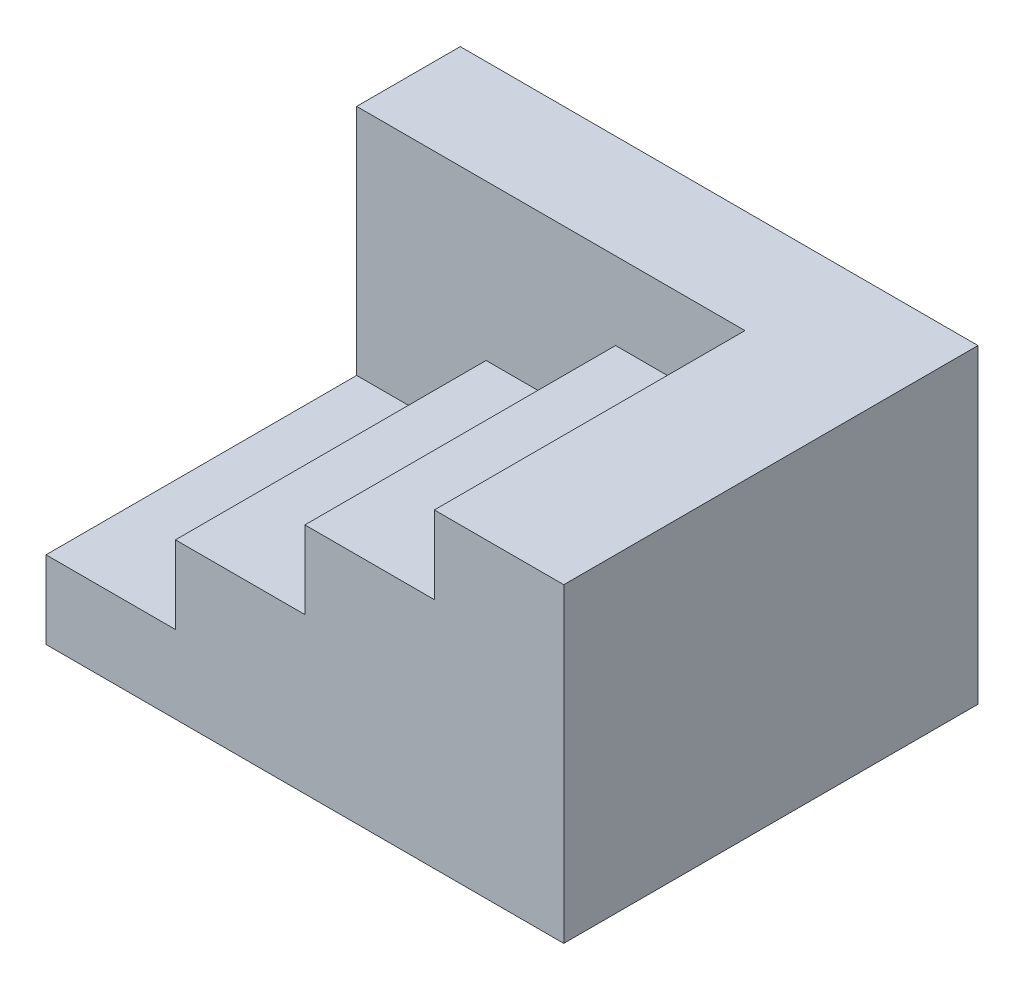
ISO-10303-21;
HEADER;
FILE_DESCRIPTION(('STEP AP214'),'2;1');
FILE_NAME('part.step','',(''),(''),'','','');
FILE_SCHEMA(('AUTOMOTIVE_DESIGN { 1 0 10303 214 1 1 1 1 }'));
ENDSEC;
DATA;
#1=APPLICATION_CONTEXT('core data for automotive mechanical design processes');
#2=APPLICATION_PROTOCOL_DEFINITION('international standard','automotive_design',2000,#1);
#3=PRODUCT_CONTEXT('',#1,'mechanical');
#4=PRODUCT('Part','Part','',(#3));
#5=PRODUCT_RELATED_PRODUCT_CATEGORY('part','',(#4));
#6=PRODUCT_DEFINITION_FORMATION('','',#4);
#7=PRODUCT_DEFINITION_CONTEXT('part definition',#1,'design');
#8=PRODUCT_DEFINITION('design','',#6,#7);
#9=PRODUCT_DEFINITION_SHAPE('','',#8);
#10=(LENGTH_UNIT() NAMED_UNIT(*) SI_UNIT(.MILLI.,.METRE.));
#11=(NAMED_UNIT(*) PLANE_ANGLE_UNIT() SI_UNIT($,.RADIAN.));
#12=(NAMED_UNIT(*) SI_UNIT($,.STERADIAN.) SOLID_ANGLE_UNIT());
#13=UNCERTAINTY_MEASURE_WITH_UNIT(LENGTH_MEASURE(1.E-05),#10,'distance_accuracy_value','');
#14=(GEOMETRIC_REPRESENTATION_CONTEXT(3) GLOBAL_UNCERTAINTY_ASSIGNED_CONTEXT((#13)) GLOBAL_UNIT_ASSIGNED_CONTEXT((#10,
#11,#12)) REPRESENTATION_CONTEXT('',''));
#15=CARTESIAN_POINT('',(0.,0.,0.));
#16=DIRECTION('',(0.,0.,1.));
#17=DIRECTION('',(1.,0.,0.));
#18=AXIS2_PLACEMENT_3D('',#15,#16,#17);
#19=CARTESIAN_POINT('',(0.,60.,0.));
#20=DIRECTION('',(1.,0.,0.));
#21=DIRECTION('',(0.,0.,-1.));
#22=AXIS2_PLACEMENT_3D('',#19,#20,#21);
#23=PLANE('',#22);
#24=DIRECTION('',(0.,-1.,0.));
#25=VECTOR('',#24,1.);
#26=CARTESIAN_POINT('',(0.,60.,0.));
#27=LINE('',#26,#25);
#28=CARTESIAN_POINT('',(0.,15.,0.));
#29=VERTEX_POINT('',#28);
#30=CARTESIAN_POINT('',(0.,0.,0.));
#31=VERTEX_POINT('',#30);
#32=EDGE_CURVE('E11',#29,#31,#27,.T.);
#33=ORIENTED_EDGE('',*,*,#32,.F.);
#34=DIRECTION('',(0.,0.,1.));
#35=VECTOR('',#34,1.);
#36=CARTESIAN_POINT('',(0.,15.,-60.));
#37=LINE('',#36,#35);
#38=CARTESIAN_POINT('',(0.,15.,-60.));
#39=VERTEX_POINT('',#38);
#40=EDGE_CURVE('E142',#39,#29,#37,.T.);
#41=ORIENTED_EDGE('',*,*,#40,.F.);
#42=DIRECTION('',(0.,-1.,0.));
#43=VECTOR('',#42,1.);
#44=CARTESIAN_POINT('',(0.,15.,-60.));
#45=LINE('',#44,#43);
#46=CARTESIAN_POINT('',(0.,60.,-60.));
#47=VERTEX_POINT('',#46);
#48=EDGE_CURVE('E149',#47,#39,#45,.T.);
#49=ORIENTED_EDGE('',*,*,#48,.F.);
#50=DIRECTION('',(0.,0.,1.));
#51=VECTOR('',#50,1.);
#52=CARTESIAN_POINT('',(0.,60.,0.));
#53=LINE('',#52,#51);
#54=CARTESIAN_POINT('',(0.,60.,-80.));
#55=VERTEX_POINT('',#54);
#56=EDGE_CURVE('E171',#55,#47,#53,.T.);
#57=ORIENTED_EDGE('',*,*,#56,.F.);
#58=DIRECTION('',(0.,-1.,0.));
#59=VECTOR('',#58,1.);
#60=CARTESIAN_POINT('',(0.,60.,-80.));
#61=LINE('',#60,#59);
#62=CARTESIAN_POINT('',(0.,0.,-80.));
#63=VERTEX_POINT('',#62);
#64=EDGE_CURVE('E181',#55,#63,#61,.T.);
#65=ORIENTED_EDGE('',*,*,#64,.T.);
#66=DIRECTION('',(0.,0.,1.));
#67=VECTOR('',#66,1.);
#68=CARTESIAN_POINT('',(0.,0.,0.));
#69=LINE('',#68,#67);
#70=EDGE_CURVE('E182',#63,#31,#69,.T.);
#71=ORIENTED_EDGE('',*,*,#70,.T.);
#72=EDGE_LOOP('',(#33,#41,#49,#57,#65,#71));
#73=FACE_BOUND('',#72,.T.);
#74=ADVANCED_FACE('F45',(#73),#23,.F.);
#75=CARTESIAN_POINT('',(0.,60.,0.));
#76=DIRECTION('',(0.,0.,-1.));
#77=DIRECTION('',(-1.,0.,0.));
#78=AXIS2_PLACEMENT_3D('',#75,#76,#77);
#79=PLANE('',#78);
#80=DIRECTION('',(1.,0.,0.));
#81=VECTOR('',#80,1.);
#82=CARTESIAN_POINT('',(0.,60.,0.));
#83=LINE('',#82,#81);
#84=CARTESIAN_POINT('',(75.,60.,0.));
#85=VERTEX_POINT('',#84);
#86=CARTESIAN_POINT('',(100.,60.,0.));
#87=VERTEX_POINT('',#86);
#88=EDGE_CURVE('E93',#85,#87,#83,.T.);
#89=ORIENTED_EDGE('',*,*,#88,.F.);
#90=DIRECTION('',(0.,1.,0.));
#91=VECTOR('',#90,1.);
#92=CARTESIAN_POINT('',(75.,60.,0.));
#93=LINE('',#92,#91);
#94=CARTESIAN_POINT('',(75.,45.,0.));
#95=VERTEX_POINT('',#94);
#96=EDGE_CURVE('E158',#95,#85,#93,.T.);
#97=ORIENTED_EDGE('',*,*,#96,.F.);
#98=DIRECTION('',(1.,0.,0.));
#99=VECTOR('',#98,1.);
#100=CARTESIAN_POINT('',(75.,45.,0.));
#101=LINE('',#100,#99);
#102=CARTESIAN_POINT('',(50.,45.,0.));
#103=VERTEX_POINT('',#102);
#104=EDGE_CURVE('E233',#103,#95,#101,.T.);
#105=ORIENTED_EDGE('',*,*,#104,.F.);
#106=DIRECTION('',(0.,1.,0.));
#107=VECTOR('',#106,1.);
#108=CARTESIAN_POINT('',(50.,45.,0.));
#109=LINE('',#108,#107);
#110=CARTESIAN_POINT('',(50.,30.,0.));
#111=VERTEX_POINT('',#110);
#112=EDGE_CURVE('E238',#111,#103,#109,.T.);
#113=ORIENTED_EDGE('',*,*,#112,.F.);
#114=DIRECTION('',(1.,0.,0.));
#115=VECTOR('',#114,1.);
#116=CARTESIAN_POINT('',(50.,30.,0.));
#117=LINE('',#116,#115);
#118=CARTESIAN_POINT('',(25.,30.,0.));
#119=VERTEX_POINT('',#118);
#120=EDGE_CURVE('E259',#119,#111,#117,.T.);
#121=ORIENTED_EDGE('',*,*,#120,.F.);
#122=DIRECTION('',(0.,1.,0.));
#123=VECTOR('',#122,1.);
#124=CARTESIAN_POINT('',(25.,30.,0.));
#125=LINE('',#124,#123);
#126=CARTESIAN_POINT('',(25.,15.,0.));
#127=VERTEX_POINT('',#126);
#128=EDGE_CURVE('E264',#127,#119,#125,.T.);
#129=ORIENTED_EDGE('',*,*,#128,.F.);
#130=DIRECTION('',(1.,0.,0.));
#131=VECTOR('',#130,1.);
#132=CARTESIAN_POINT('',(25.,15.,0.));
#133=LINE('',#132,#131);
#134=EDGE_CURVE('E267',#29,#127,#133,.T.);
#135=ORIENTED_EDGE('',*,*,#134,.F.);
#136=ORIENTED_EDGE('',*,*,#32,.T.);
#137=DIRECTION('',(1.,0.,0.));
#138=VECTOR('',#137,1.);
#139=CARTESIAN_POINT('',(0.,0.,0.));
#140=LINE('',#139,#138);
#141=CARTESIAN_POINT('',(100.,0.,0.));
#142=VERTEX_POINT('',#141);
#143=EDGE_CURVE('E185',#31,#142,#140,.T.);
#144=ORIENTED_EDGE('',*,*,#143,.T.);
#145=DIRECTION('',(0.,-1.,0.));
#146=VECTOR('',#145,1.);
#147=CARTESIAN_POINT('',(100.,60.,0.));
#148=LINE('',#147,#146);
#149=EDGE_CURVE('E53',#87,#142,#148,.T.);
#150=ORIENTED_EDGE('',*,*,#149,.F.);
#151=EDGE_LOOP('',(#89,#97,#105,#113,#121,#129,#135,#136,#144,#150));
#152=FACE_BOUND('',#151,.T.);
#153=ADVANCED_FACE('F220',(#152),#79,.F.);
#154=CARTESIAN_POINT('',(100.,60.,0.));
#155=DIRECTION('',(-1.,0.,0.));
#156=DIRECTION('',(0.,0.,1.));
#157=AXIS2_PLACEMENT_3D('',#154,#155,#156);
#158=PLANE('',#157);
#159=DIRECTION('',(0.,0.,-1.));
#160=VECTOR('',#159,1.);
#161=CARTESIAN_POINT('',(100.,0.,0.));
#162=LINE('',#161,#160);
#163=CARTESIAN_POINT('',(100.,0.,-80.));
#164=VERTEX_POINT('',#163);
#165=EDGE_CURVE('E189',#142,#164,#162,.T.);
#166=ORIENTED_EDGE('',*,*,#165,.T.);
#167=DIRECTION('',(0.,-1.,0.));
#168=VECTOR('',#167,1.);
#169=CARTESIAN_POINT('',(100.,60.,-80.));
#170=LINE('',#169,#168);
#171=CARTESIAN_POINT('',(100.,60.,-80.));
#172=VERTEX_POINT('',#171);
#173=EDGE_CURVE('E196',#172,#164,#170,.T.);
#174=ORIENTED_EDGE('',*,*,#173,.F.);
#175=DIRECTION('',(0.,0.,-1.));
#176=VECTOR('',#175,1.);
#177=CARTESIAN_POINT('',(100.,60.,0.));
#178=LINE('',#177,#176);
#179=EDGE_CURVE('E176',#87,#172,#178,.T.);
#180=ORIENTED_EDGE('',*,*,#179,.F.);
#181=ORIENTED_EDGE('',*,*,#149,.T.);
#182=EDGE_LOOP('',(#166,#174,#180,#181));
#183=FACE_BOUND('',#182,.T.);
#184=ADVANCED_FACE('F203',(#183),#158,.F.);
#185=CARTESIAN_POINT('',(0.,60.,-80.));
#186=DIRECTION('',(0.,0.,1.));
#187=DIRECTION('',(1.,0.,0.));
#188=AXIS2_PLACEMENT_3D('',#185,#186,#187);
#189=PLANE('',#188);
#190=DIRECTION('',(-1.,0.,0.));
#191=VECTOR('',#190,1.);
#192=CARTESIAN_POINT('',(0.,0.,-80.));
#193=LINE('',#192,#191);
#194=EDGE_CURVE('E88',#164,#63,#193,.T.);
#195=ORIENTED_EDGE('',*,*,#194,.T.);
#196=ORIENTED_EDGE('',*,*,#64,.F.);
#197=DIRECTION('',(-1.,0.,0.));
#198=VECTOR('',#197,1.);
#199=CARTESIAN_POINT('',(0.,60.,-80.));
#200=LINE('',#199,#198);
#201=EDGE_CURVE('E69',#172,#55,#200,.T.);
#202=ORIENTED_EDGE('',*,*,#201,.F.);
#203=ORIENTED_EDGE('',*,*,#173,.T.);
#204=EDGE_LOOP('',(#195,#196,#202,#203));
#205=FACE_BOUND('',#204,.T.);
#206=ADVANCED_FACE('F210',(#205),#189,.F.);
#207=CARTESIAN_POINT('',(0.,60.,0.));
#208=DIRECTION('',(0.,-1.,0.));
#209=DIRECTION('',(0.,0.,-1.));
#210=AXIS2_PLACEMENT_3D('',#207,#208,#209);
#211=PLANE('',#210);
#212=DIRECTION('',(-1.,0.,0.));
#213=VECTOR('',#212,1.);
#214=CARTESIAN_POINT('',(0.,60.,-60.));
#215=LINE('',#214,#213);
#216=CARTESIAN_POINT('',(75.,60.,-60.));
#217=VERTEX_POINT('',#216);
#218=EDGE_CURVE('E154',#217,#47,#215,.T.);
#219=ORIENTED_EDGE('',*,*,#218,.F.);
#220=DIRECTION('',(0.,0.,1.));
#221=VECTOR('',#220,1.);
#222=CARTESIAN_POINT('',(75.,60.,-60.));
#223=LINE('',#222,#221);
#224=EDGE_CURVE('E186',#217,#85,#223,.T.);
#225=ORIENTED_EDGE('',*,*,#224,.T.);
#226=ORIENTED_EDGE('',*,*,#88,.T.);
#227=ORIENTED_EDGE('',*,*,#179,.T.);
#228=ORIENTED_EDGE('',*,*,#201,.T.);
#229=ORIENTED_EDGE('',*,*,#56,.T.);
#230=EDGE_LOOP('',(#219,#225,#226,#227,#228,#229));
#231=FACE_BOUND('',#230,.T.);
#232=ADVANCED_FACE('F212',(#231),#211,.F.);
#233=CARTESIAN_POINT('',(0.,0.,0.));
#234=DIRECTION('',(0.,-1.,0.));
#235=DIRECTION('',(0.,0.,-1.));
#236=AXIS2_PLACEMENT_3D('',#233,#234,#235);
#237=PLANE('',#236);
#238=ORIENTED_EDGE('',*,*,#70,.F.);
#239=ORIENTED_EDGE('',*,*,#194,.F.);
#240=ORIENTED_EDGE('',*,*,#165,.F.);
#241=ORIENTED_EDGE('',*,*,#143,.F.);
#242=EDGE_LOOP('',(#238,#239,#240,#241));
#243=FACE_BOUND('',#242,.T.);
#244=ADVANCED_FACE('F209',(#243),#237,.T.);
#245=CARTESIAN_POINT('',(75.,60.,-60.));
#246=DIRECTION('',(1.,0.,0.));
#247=DIRECTION('',(0.,1.,0.));
#248=AXIS2_PLACEMENT_3D('',#245,#246,#247);
#249=PLANE('',#248);
#250=ORIENTED_EDGE('',*,*,#96,.T.);
#251=ORIENTED_EDGE('',*,*,#224,.F.);
#252=DIRECTION('',(0.,1.,0.));
#253=VECTOR('',#252,1.);
#254=CARTESIAN_POINT('',(75.,60.,-60.));
#255=LINE('',#254,#253);
#256=CARTESIAN_POINT('',(75.,45.,-60.));
#257=VERTEX_POINT('',#256);
#258=EDGE_CURVE('E60',#257,#217,#255,.T.);
#259=ORIENTED_EDGE('',*,*,#258,.F.);
#260=DIRECTION('',(0.,0.,1.));
#261=VECTOR('',#260,1.);
#262=CARTESIAN_POINT('',(75.,45.,-60.));
#263=LINE('',#262,#261);
#264=EDGE_CURVE('E244',#257,#95,#263,.T.);
#265=ORIENTED_EDGE('',*,*,#264,.T.);
#266=EDGE_LOOP('',(#250,#251,#259,#265));
#267=FACE_BOUND('',#266,.T.);
#268=ADVANCED_FACE('F294',(#267),#249,.F.);
#269=CARTESIAN_POINT('',(75.,45.,-60.));
#270=DIRECTION('',(0.,-1.,0.));
#271=DIRECTION('',(1.,0.,0.));
#272=AXIS2_PLACEMENT_3D('',#269,#270,#271);
#273=PLANE('',#272);
#274=ORIENTED_EDGE('',*,*,#104,.T.);
#275=ORIENTED_EDGE('',*,*,#264,.F.);
#276=DIRECTION('',(1.,0.,0.));
#277=VECTOR('',#276,1.);
#278=CARTESIAN_POINT('',(75.,45.,-60.));
#279=LINE('',#278,#277);
#280=CARTESIAN_POINT('',(50.,45.,-60.));
#281=VERTEX_POINT('',#280);
#282=EDGE_CURVE('E278',#281,#257,#279,.T.);
#283=ORIENTED_EDGE('',*,*,#282,.F.);
#284=DIRECTION('',(0.,0.,1.));
#285=VECTOR('',#284,1.);
#286=CARTESIAN_POINT('',(50.,45.,-60.));
#287=LINE('',#286,#285);
#288=EDGE_CURVE('E247',#281,#103,#287,.T.);
#289=ORIENTED_EDGE('',*,*,#288,.T.);
#290=EDGE_LOOP('',(#274,#275,#283,#289));
#291=FACE_BOUND('',#290,.T.);
#292=ADVANCED_FACE('F293',(#291),#273,.F.);
#293=CARTESIAN_POINT('',(50.,45.,-60.));
#294=DIRECTION('',(1.,0.,0.));
#295=DIRECTION('',(0.,0.,-1.));
#296=AXIS2_PLACEMENT_3D('',#293,#294,#295);
#297=PLANE('',#296);
#298=ORIENTED_EDGE('',*,*,#112,.T.);
#299=ORIENTED_EDGE('',*,*,#288,.F.);
#300=DIRECTION('',(0.,1.,0.));
#301=VECTOR('',#300,1.);
#302=CARTESIAN_POINT('',(50.,45.,-60.));
#303=LINE('',#302,#301);
#304=CARTESIAN_POINT('',(50.,30.,-60.));
#305=VERTEX_POINT('',#304);
#306=EDGE_CURVE('E281',#305,#281,#303,.T.);
#307=ORIENTED_EDGE('',*,*,#306,.F.);
#308=DIRECTION('',(0.,0.,1.));
#309=VECTOR('',#308,1.);
#310=CARTESIAN_POINT('',(50.,30.,-60.));
#311=LINE('',#310,#309);
#312=EDGE_CURVE('E250',#305,#111,#311,.T.);
#313=ORIENTED_EDGE('',*,*,#312,.T.);
#314=EDGE_LOOP('',(#298,#299,#307,#313));
#315=FACE_BOUND('',#314,.T.);
#316=ADVANCED_FACE('F291',(#315),#297,.F.);
#317=CARTESIAN_POINT('',(50.,30.,-60.));
#318=DIRECTION('',(0.,-1.,0.));
#319=DIRECTION('',(1.,0.,0.));
#320=AXIS2_PLACEMENT_3D('',#317,#318,#319);
#321=PLANE('',#320);
#322=ORIENTED_EDGE('',*,*,#120,.T.);
#323=ORIENTED_EDGE('',*,*,#312,.F.);
#324=DIRECTION('',(1.,0.,0.));
#325=VECTOR('',#324,1.);
#326=CARTESIAN_POINT('',(50.,30.,-60.));
#327=LINE('',#326,#325);
#328=CARTESIAN_POINT('',(25.,30.,-60.));
#329=VERTEX_POINT('',#328);
#330=EDGE_CURVE('E261',#329,#305,#327,.T.);
#331=ORIENTED_EDGE('',*,*,#330,.F.);
#332=DIRECTION('',(0.,0.,1.));
#333=VECTOR('',#332,1.);
#334=CARTESIAN_POINT('',(25.,30.,-60.));
#335=LINE('',#334,#333);
#336=EDGE_CURVE('E166',#329,#119,#335,.T.);
#337=ORIENTED_EDGE('',*,*,#336,.T.);
#338=EDGE_LOOP('',(#322,#323,#331,#337));
#339=FACE_BOUND('',#338,.T.);
#340=ADVANCED_FACE('F257',(#339),#321,.F.);
#341=CARTESIAN_POINT('',(25.,30.,-60.));
#342=DIRECTION('',(1.,0.,0.));
#343=DIRECTION('',(0.,1.,0.));
#344=AXIS2_PLACEMENT_3D('',#341,#342,#343);
#345=PLANE('',#344);
#346=ORIENTED_EDGE('',*,*,#128,.T.);
#347=ORIENTED_EDGE('',*,*,#336,.F.);
#348=DIRECTION('',(0.,1.,0.));
#349=VECTOR('',#348,1.);
#350=CARTESIAN_POINT('',(25.,30.,-60.));
#351=LINE('',#350,#349);
#352=CARTESIAN_POINT('',(25.,15.,-60.));
#353=VERTEX_POINT('',#352);
#354=EDGE_CURVE('E148',#353,#329,#351,.T.);
#355=ORIENTED_EDGE('',*,*,#354,.F.);
#356=DIRECTION('',(0.,0.,1.));
#357=VECTOR('',#356,1.);
#358=CARTESIAN_POINT('',(25.,15.,-60.));
#359=LINE('',#358,#357);
#360=EDGE_CURVE('E144',#353,#127,#359,.T.);
#361=ORIENTED_EDGE('',*,*,#360,.T.);
#362=EDGE_LOOP('',(#346,#347,#355,#361));
#363=FACE_BOUND('',#362,.T.);
#364=ADVANCED_FACE('F265',(#363),#345,.F.);
#365=CARTESIAN_POINT('',(25.,15.,-60.));
#366=DIRECTION('',(0.,-1.,0.));
#367=DIRECTION('',(1.,0.,0.));
#368=AXIS2_PLACEMENT_3D('',#365,#366,#367);
#369=PLANE('',#368);
#370=ORIENTED_EDGE('',*,*,#134,.T.);
#371=ORIENTED_EDGE('',*,*,#360,.F.);
#372=DIRECTION('',(1.,0.,0.));
#373=VECTOR('',#372,1.);
#374=CARTESIAN_POINT('',(25.,15.,-60.));
#375=LINE('',#374,#373);
#376=EDGE_CURVE('E137',#39,#353,#375,.T.);
#377=ORIENTED_EDGE('',*,*,#376,.F.);
#378=ORIENTED_EDGE('',*,*,#40,.T.);
#379=EDGE_LOOP('',(#370,#371,#377,#378));
#380=FACE_BOUND('',#379,.T.);
#381=ADVANCED_FACE('F140',(#380),#369,.F.);
#382=CARTESIAN_POINT('',(0.,0.,-60.));
#383=DIRECTION('',(0.,0.,-1.));
#384=DIRECTION('',(-1.,0.,0.));
#385=AXIS2_PLACEMENT_3D('',#382,#383,#384);
#386=PLANE('',#385);
#387=ORIENTED_EDGE('',*,*,#48,.T.);
#388=ORIENTED_EDGE('',*,*,#376,.T.);
#389=ORIENTED_EDGE('',*,*,#354,.T.);
#390=ORIENTED_EDGE('',*,*,#330,.T.);
#391=ORIENTED_EDGE('',*,*,#306,.T.);
#392=ORIENTED_EDGE('',*,*,#282,.T.);
#393=ORIENTED_EDGE('',*,*,#258,.T.);
#394=ORIENTED_EDGE('',*,*,#218,.T.);
#395=EDGE_LOOP('',(#387,#388,#389,#390,#391,#392,#393,#394));
#396=FACE_BOUND('',#395,.T.);
#397=ADVANCED_FACE('F152',(#396),#386,.F.);
#398=CLOSED_SHELL('',(#74,#153,#184,#206,#232,#244,#268,#292,#316,#340,#364,#381,#397));
#399=MANIFOLD_SOLID_BREP('B2',#398);
#400=ADVANCED_BREP_SHAPE_REPRESENTATION('',(#18,#399),#14);
#401=SHAPE_DEFINITION_REPRESENTATION(#9,#400);
ENDSEC;
END-ISO-10303-21;
